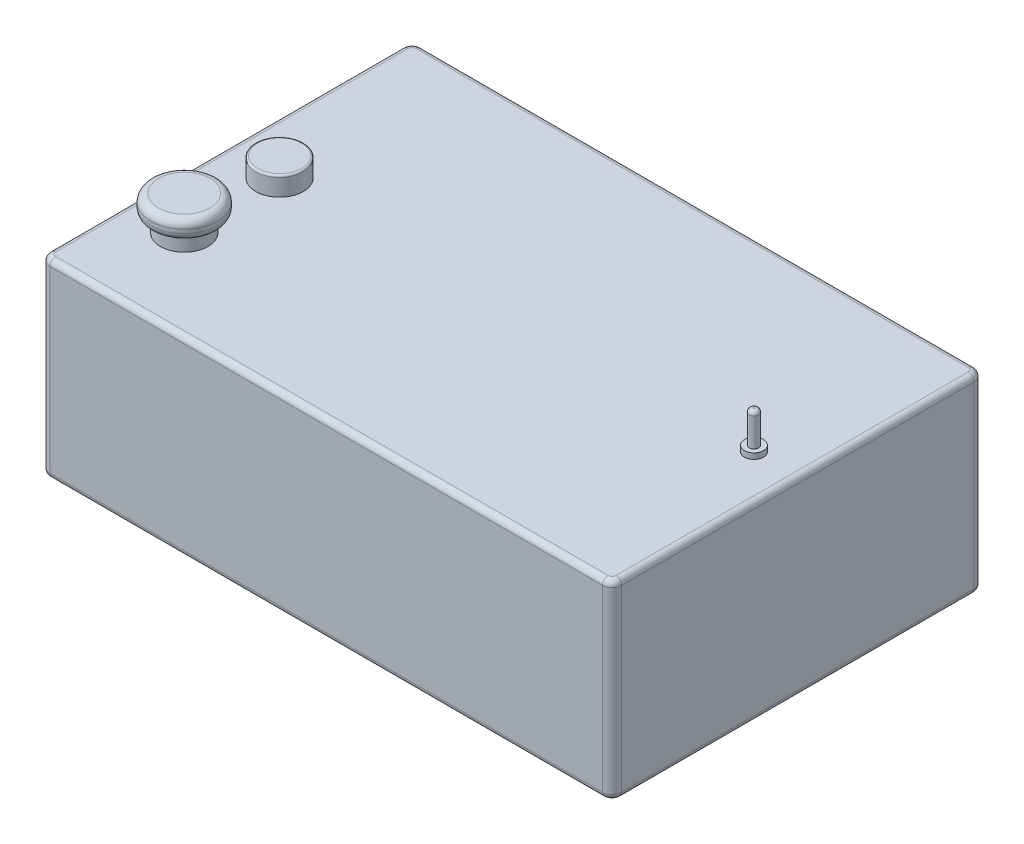
ISO-10303-21;
HEADER;
FILE_DESCRIPTION(('STEP AP214'),'2;1');
FILE_NAME('part.step','',(''),(''),'','','');
FILE_SCHEMA(('AUTOMOTIVE_DESIGN { 1 0 10303 214 1 1 1 1 }'));
ENDSEC;
DATA;
#1=APPLICATION_CONTEXT('core data for automotive mechanical design processes');
#2=APPLICATION_PROTOCOL_DEFINITION('international standard','automotive_design',2000,#1);
#3=PRODUCT_CONTEXT('',#1,'mechanical');
#4=PRODUCT('Part','Part','',(#3));
#5=PRODUCT_RELATED_PRODUCT_CATEGORY('part','',(#4));
#6=PRODUCT_DEFINITION_FORMATION('','',#4);
#7=PRODUCT_DEFINITION_CONTEXT('part definition',#1,'design');
#8=PRODUCT_DEFINITION('design','',#6,#7);
#9=PRODUCT_DEFINITION_SHAPE('','',#8);
#10=(LENGTH_UNIT() NAMED_UNIT(*) SI_UNIT(.MILLI.,.METRE.));
#11=(NAMED_UNIT(*) PLANE_ANGLE_UNIT() SI_UNIT($,.RADIAN.));
#12=(NAMED_UNIT(*) SI_UNIT($,.STERADIAN.) SOLID_ANGLE_UNIT());
#13=UNCERTAINTY_MEASURE_WITH_UNIT(LENGTH_MEASURE(1.E-05),#10,'distance_accuracy_value','');
#14=(GEOMETRIC_REPRESENTATION_CONTEXT(3) GLOBAL_UNCERTAINTY_ASSIGNED_CONTEXT((#13)) GLOBAL_UNIT_ASSIGNED_CONTEXT((#10,
#11,#12)) REPRESENTATION_CONTEXT('',''));
#15=CARTESIAN_POINT('',(0.,0.,0.));
#16=DIRECTION('',(0.,0.,1.));
#17=DIRECTION('',(1.,0.,0.));
#18=AXIS2_PLACEMENT_3D('',#15,#16,#17);
#19=CARTESIAN_POINT('',(-145.,100.,92.5));
#20=DIRECTION('',(0.,-1.,0.));
#21=DIRECTION('',(0.,0.,-1.));
#22=AXIS2_PLACEMENT_3D('',#19,#20,#21);
#23=CYLINDRICAL_SURFACE('',#22,5.00000000000002);
#24=DIRECTION('',(0.,-1.,0.));
#25=VECTOR('',#24,1.);
#26=CARTESIAN_POINT('',(-150.,100.,92.5));
#27=LINE('',#26,#25);
#28=CARTESIAN_POINT('',(-150.,97.,92.5));
#29=VERTEX_POINT('',#28);
#30=CARTESIAN_POINT('',(-150.,3.,92.5));
#31=VERTEX_POINT('',#30);
#32=EDGE_CURVE('E266',#29,#31,#27,.T.);
#33=ORIENTED_EDGE('',*,*,#32,.T.);
#34=CARTESIAN_POINT('',(-145.,3.,92.5));
#35=DIRECTION('',(0.,1.,0.));
#36=DIRECTION('',(0.,0.,1.));
#37=AXIS2_PLACEMENT_3D('',#34,#35,#36);
#38=CIRCLE('',#37,5.00000000000002);
#39=CARTESIAN_POINT('',(-145.,3.,97.5));
#40=VERTEX_POINT('',#39);
#41=EDGE_CURVE('E353',#31,#40,#38,.T.);
#42=ORIENTED_EDGE('',*,*,#41,.T.);
#43=DIRECTION('',(0.,-1.,0.));
#44=VECTOR('',#43,1.);
#45=CARTESIAN_POINT('',(-145.,100.,97.5));
#46=LINE('',#45,#44);
#47=CARTESIAN_POINT('',(-145.,97.,97.5));
#48=VERTEX_POINT('',#47);
#49=EDGE_CURVE('E180',#48,#40,#46,.T.);
#50=ORIENTED_EDGE('',*,*,#49,.F.);
#51=CARTESIAN_POINT('',(-145.,97.,92.5));
#52=DIRECTION('',(0.,1.,0.));
#53=DIRECTION('',(0.,0.,1.));
#54=AXIS2_PLACEMENT_3D('',#51,#52,#53);
#55=CIRCLE('',#54,5.00000000000002);
#56=EDGE_CURVE('E350',#48,#29,#55,.F.);
#57=ORIENTED_EDGE('',*,*,#56,.T.);
#58=EDGE_LOOP('',(#33,#42,#50,#57));
#59=FACE_BOUND('',#58,.T.);
#60=ADVANCED_FACE('F39',(#59),#23,.T.);
#61=CARTESIAN_POINT('',(-145.,100.,97.5));
#62=DIRECTION('',(0.,0.,-1.));
#63=DIRECTION('',(-1.,0.,0.));
#64=AXIS2_PLACEMENT_3D('',#61,#62,#63);
#65=PLANE('',#64);
#66=ORIENTED_EDGE('',*,*,#49,.T.);
#67=DIRECTION('',(1.,0.,0.));
#68=VECTOR('',#67,1.);
#69=CARTESIAN_POINT('',(-145.,3.,97.5));
#70=LINE('',#69,#68);
#71=CARTESIAN_POINT('',(145.,3.,97.5));
#72=VERTEX_POINT('',#71);
#73=EDGE_CURVE('E178',#40,#72,#70,.T.);
#74=ORIENTED_EDGE('',*,*,#73,.T.);
#75=DIRECTION('',(0.,-1.,0.));
#76=VECTOR('',#75,1.);
#77=CARTESIAN_POINT('',(145.,100.,97.5));
#78=LINE('',#77,#76);
#79=CARTESIAN_POINT('',(145.,97.,97.5));
#80=VERTEX_POINT('',#79);
#81=EDGE_CURVE('E159',#80,#72,#78,.T.);
#82=ORIENTED_EDGE('',*,*,#81,.F.);
#83=DIRECTION('',(1.,0.,0.));
#84=VECTOR('',#83,1.);
#85=CARTESIAN_POINT('',(-145.,97.,97.5));
#86=LINE('',#85,#84);
#87=EDGE_CURVE('E175',#80,#48,#86,.F.);
#88=ORIENTED_EDGE('',*,*,#87,.T.);
#89=EDGE_LOOP('',(#66,#74,#82,#88));
#90=FACE_BOUND('',#89,.T.);
#91=ADVANCED_FACE('F174',(#90),#65,.F.);
#92=CARTESIAN_POINT('',(145.,100.,92.5));
#93=DIRECTION('',(0.,-1.,0.));
#94=DIRECTION('',(0.,0.,-1.));
#95=AXIS2_PLACEMENT_3D('',#92,#93,#94);
#96=CYLINDRICAL_SURFACE('',#95,5.00000000000003);
#97=ORIENTED_EDGE('',*,*,#81,.T.);
#98=CARTESIAN_POINT('',(145.,3.,92.5));
#99=DIRECTION('',(0.,1.,0.));
#100=DIRECTION('',(0.,0.,1.));
#101=AXIS2_PLACEMENT_3D('',#98,#99,#100);
#102=CIRCLE('',#101,5.00000000000003);
#103=CARTESIAN_POINT('',(150.,3.,92.5));
#104=VERTEX_POINT('',#103);
#105=EDGE_CURVE('E167',#72,#104,#102,.T.);
#106=ORIENTED_EDGE('',*,*,#105,.T.);
#107=DIRECTION('',(0.,-1.,0.));
#108=VECTOR('',#107,1.);
#109=CARTESIAN_POINT('',(150.,100.,92.5));
#110=LINE('',#109,#108);
#111=CARTESIAN_POINT('',(150.,97.,92.5));
#112=VERTEX_POINT('',#111);
#113=EDGE_CURVE('E161',#112,#104,#110,.T.);
#114=ORIENTED_EDGE('',*,*,#113,.F.);
#115=CARTESIAN_POINT('',(145.,97.,92.5));
#116=DIRECTION('',(0.,1.,0.));
#117=DIRECTION('',(0.,0.,1.));
#118=AXIS2_PLACEMENT_3D('',#115,#116,#117);
#119=CIRCLE('',#118,5.00000000000003);
#120=EDGE_CURVE('E156',#112,#80,#119,.F.);
#121=ORIENTED_EDGE('',*,*,#120,.T.);
#122=EDGE_LOOP('',(#97,#106,#114,#121));
#123=FACE_BOUND('',#122,.T.);
#124=ADVANCED_FACE('F158',(#123),#96,.T.);
#125=CARTESIAN_POINT('',(150.,100.,-92.5));
#126=DIRECTION('',(-1.,0.,0.));
#127=DIRECTION('',(0.,0.,1.));
#128=AXIS2_PLACEMENT_3D('',#125,#126,#127);
#129=PLANE('',#128);
#130=ORIENTED_EDGE('',*,*,#113,.T.);
#131=DIRECTION('',(0.,0.,-1.));
#132=VECTOR('',#131,1.);
#133=CARTESIAN_POINT('',(150.,3.,-92.5));
#134=LINE('',#133,#132);
#135=CARTESIAN_POINT('',(150.,3.,-92.5));
#136=VERTEX_POINT('',#135);
#137=EDGE_CURVE('E322',#104,#136,#134,.T.);
#138=ORIENTED_EDGE('',*,*,#137,.T.);
#139=DIRECTION('',(0.,-1.,0.));
#140=VECTOR('',#139,1.);
#141=CARTESIAN_POINT('',(150.,100.,-92.5));
#142=LINE('',#141,#140);
#143=CARTESIAN_POINT('',(150.,97.,-92.5));
#144=VERTEX_POINT('',#143);
#145=EDGE_CURVE('E283',#144,#136,#142,.T.);
#146=ORIENTED_EDGE('',*,*,#145,.F.);
#147=DIRECTION('',(0.,0.,-1.));
#148=VECTOR('',#147,1.);
#149=CARTESIAN_POINT('',(150.,97.,92.5));
#150=LINE('',#149,#148);
#151=EDGE_CURVE('E319',#144,#112,#150,.F.);
#152=ORIENTED_EDGE('',*,*,#151,.T.);
#153=EDGE_LOOP('',(#130,#138,#146,#152));
#154=FACE_BOUND('',#153,.T.);
#155=ADVANCED_FACE('F454',(#154),#129,.F.);
#156=CARTESIAN_POINT('',(145.,100.,-92.5));
#157=DIRECTION('',(0.,-1.,0.));
#158=DIRECTION('',(0.,0.,-1.));
#159=AXIS2_PLACEMENT_3D('',#156,#157,#158);
#160=CYLINDRICAL_SURFACE('',#159,5.);
#161=ORIENTED_EDGE('',*,*,#145,.T.);
#162=CARTESIAN_POINT('',(145.,3.,-92.5));
#163=DIRECTION('',(0.,1.,0.));
#164=DIRECTION('',(0.,0.,1.));
#165=AXIS2_PLACEMENT_3D('',#162,#163,#164);
#166=CIRCLE('',#165,5.);
#167=CARTESIAN_POINT('',(145.,3.,-97.5));
#168=VERTEX_POINT('',#167);
#169=EDGE_CURVE('E329',#136,#168,#166,.T.);
#170=ORIENTED_EDGE('',*,*,#169,.T.);
#171=DIRECTION('',(0.,-1.,0.));
#172=VECTOR('',#171,1.);
#173=CARTESIAN_POINT('',(145.,100.,-97.5));
#174=LINE('',#173,#172);
#175=CARTESIAN_POINT('',(145.,97.,-97.5));
#176=VERTEX_POINT('',#175);
#177=EDGE_CURVE('E279',#176,#168,#174,.T.);
#178=ORIENTED_EDGE('',*,*,#177,.F.);
#179=CARTESIAN_POINT('',(145.,97.,-92.5));
#180=DIRECTION('',(0.,1.,0.));
#181=DIRECTION('',(0.,0.,1.));
#182=AXIS2_PLACEMENT_3D('',#179,#180,#181);
#183=CIRCLE('',#182,5.);
#184=EDGE_CURVE('E325',#176,#144,#183,.F.);
#185=ORIENTED_EDGE('',*,*,#184,.T.);
#186=EDGE_LOOP('',(#161,#170,#178,#185));
#187=FACE_BOUND('',#186,.T.);
#188=ADVANCED_FACE('F467',(#187),#160,.T.);
#189=CARTESIAN_POINT('',(-145.,100.,-97.5));
#190=DIRECTION('',(0.,0.,1.));
#191=DIRECTION('',(1.,0.,0.));
#192=AXIS2_PLACEMENT_3D('',#189,#190,#191);
#193=PLANE('',#192);
#194=ORIENTED_EDGE('',*,*,#177,.T.);
#195=DIRECTION('',(-1.,0.,0.));
#196=VECTOR('',#195,1.);
#197=CARTESIAN_POINT('',(-145.,3.,-97.5));
#198=LINE('',#197,#196);
#199=CARTESIAN_POINT('',(-145.,3.,-97.5));
#200=VERTEX_POINT('',#199);
#201=EDGE_CURVE('E335',#168,#200,#198,.T.);
#202=ORIENTED_EDGE('',*,*,#201,.T.);
#203=DIRECTION('',(0.,-1.,0.));
#204=VECTOR('',#203,1.);
#205=CARTESIAN_POINT('',(-145.,100.,-97.5));
#206=LINE('',#205,#204);
#207=CARTESIAN_POINT('',(-145.,97.,-97.5));
#208=VERTEX_POINT('',#207);
#209=EDGE_CURVE('E275',#208,#200,#206,.T.);
#210=ORIENTED_EDGE('',*,*,#209,.F.);
#211=DIRECTION('',(-1.,0.,0.));
#212=VECTOR('',#211,1.);
#213=CARTESIAN_POINT('',(145.,97.,-97.5));
#214=LINE('',#213,#212);
#215=EDGE_CURVE('E332',#208,#176,#214,.F.);
#216=ORIENTED_EDGE('',*,*,#215,.T.);
#217=EDGE_LOOP('',(#194,#202,#210,#216));
#218=FACE_BOUND('',#217,.T.);
#219=ADVANCED_FACE('F470',(#218),#193,.F.);
#220=CARTESIAN_POINT('',(-145.,100.,-92.5));
#221=DIRECTION('',(0.,-1.,0.));
#222=DIRECTION('',(0.,0.,-1.));
#223=AXIS2_PLACEMENT_3D('',#220,#221,#222);
#224=CYLINDRICAL_SURFACE('',#223,5.00000000000002);
#225=ORIENTED_EDGE('',*,*,#209,.T.);
#226=CARTESIAN_POINT('',(-145.,3.,-92.5));
#227=DIRECTION('',(0.,1.,0.));
#228=DIRECTION('',(0.,0.,1.));
#229=AXIS2_PLACEMENT_3D('',#226,#227,#228);
#230=CIRCLE('',#229,5.00000000000002);
#231=CARTESIAN_POINT('',(-150.,3.,-92.5));
#232=VERTEX_POINT('',#231);
#233=EDGE_CURVE('E341',#200,#232,#230,.T.);
#234=ORIENTED_EDGE('',*,*,#233,.T.);
#235=DIRECTION('',(0.,-1.,0.));
#236=VECTOR('',#235,1.);
#237=CARTESIAN_POINT('',(-150.,100.,-92.5));
#238=LINE('',#237,#236);
#239=CARTESIAN_POINT('',(-150.,97.,-92.5));
#240=VERTEX_POINT('',#239);
#241=EDGE_CURVE('E270',#240,#232,#238,.T.);
#242=ORIENTED_EDGE('',*,*,#241,.F.);
#243=CARTESIAN_POINT('',(-145.,97.,-92.5));
#244=DIRECTION('',(0.,1.,0.));
#245=DIRECTION('',(0.,0.,1.));
#246=AXIS2_PLACEMENT_3D('',#243,#244,#245);
#247=CIRCLE('',#246,5.00000000000002);
#248=EDGE_CURVE('E338',#240,#208,#247,.F.);
#249=ORIENTED_EDGE('',*,*,#248,.T.);
#250=EDGE_LOOP('',(#225,#234,#242,#249));
#251=FACE_BOUND('',#250,.T.);
#252=ADVANCED_FACE('F482',(#251),#224,.T.);
#253=CARTESIAN_POINT('',(-150.,100.,-92.5));
#254=DIRECTION('',(1.,0.,0.));
#255=DIRECTION('',(0.,0.,-1.));
#256=AXIS2_PLACEMENT_3D('',#253,#254,#255);
#257=PLANE('',#256);
#258=ORIENTED_EDGE('',*,*,#241,.T.);
#259=DIRECTION('',(0.,0.,1.));
#260=VECTOR('',#259,1.);
#261=CARTESIAN_POINT('',(-150.,3.,-92.5));
#262=LINE('',#261,#260);
#263=EDGE_CURVE('E347',#232,#31,#262,.T.);
#264=ORIENTED_EDGE('',*,*,#263,.T.);
#265=ORIENTED_EDGE('',*,*,#32,.F.);
#266=DIRECTION('',(0.,0.,1.));
#267=VECTOR('',#266,1.);
#268=CARTESIAN_POINT('',(-150.,97.,-92.5));
#269=LINE('',#268,#267);
#270=EDGE_CURVE('E344',#29,#240,#269,.F.);
#271=ORIENTED_EDGE('',*,*,#270,.T.);
#272=EDGE_LOOP('',(#258,#264,#265,#271));
#273=FACE_BOUND('',#272,.T.);
#274=ADVANCED_FACE('F431',(#273),#257,.F.);
#275=CARTESIAN_POINT('',(-145.,100.,92.5));
#276=DIRECTION('',(0.,1.,0.));
#277=DIRECTION('',(0.,0.,1.));
#278=AXIS2_PLACEMENT_3D('',#275,#276,#277);
#279=PLANE('',#278);
#280=CARTESIAN_POINT('',(127.,100.,0.));
#281=DIRECTION('',(0.,1.,0.));
#282=DIRECTION('',(0.,0.,1.));
#283=AXIS2_PLACEMENT_3D('',#280,#281,#282);
#284=CIRCLE('',#283,4.99999999999999);
#285=CARTESIAN_POINT('',(127.,100.,4.99999999999999));
#286=VERTEX_POINT('',#285);
#287=EDGE_CURVE('E251',#286,#286,#284,.T.);
#288=ORIENTED_EDGE('',*,*,#287,.F.);
#289=EDGE_LOOP('',(#288));
#290=FACE_BOUND('',#289,.T.);
#291=CARTESIAN_POINT('',(-122.,100.,50.));
#292=DIRECTION('',(0.,1.,0.));
#293=DIRECTION('',(0.,0.,1.));
#294=AXIS2_PLACEMENT_3D('',#291,#292,#293);
#295=CIRCLE('',#294,12.5);
#296=CARTESIAN_POINT('',(-122.,100.,62.5));
#297=VERTEX_POINT('',#296);
#298=EDGE_CURVE('E250',#297,#297,#295,.T.);
#299=ORIENTED_EDGE('',*,*,#298,.F.);
#300=EDGE_LOOP('',(#299));
#301=FACE_BOUND('',#300,.T.);
#302=CARTESIAN_POINT('',(-122.,100.,0.));
#303=DIRECTION('',(0.,1.,0.));
#304=DIRECTION('',(0.,0.,1.));
#305=AXIS2_PLACEMENT_3D('',#302,#303,#304);
#306=CIRCLE('',#305,12.5);
#307=CARTESIAN_POINT('',(-122.,100.,12.5));
#308=VERTEX_POINT('',#307);
#309=EDGE_CURVE('E259',#308,#308,#306,.T.);
#310=ORIENTED_EDGE('',*,*,#309,.F.);
#311=EDGE_LOOP('',(#310));
#312=FACE_BOUND('',#311,.T.);
#313=DIRECTION('',(0.,0.,-1.));
#314=VECTOR('',#313,1.);
#315=CARTESIAN_POINT('',(147.,100.,-92.5));
#316=LINE('',#315,#314);
#317=CARTESIAN_POINT('',(147.,100.,92.5));
#318=VERTEX_POINT('',#317);
#319=CARTESIAN_POINT('',(147.,100.,-92.5));
#320=VERTEX_POINT('',#319);
#321=EDGE_CURVE('E356',#318,#320,#316,.T.);
#322=ORIENTED_EDGE('',*,*,#321,.T.);
#323=CARTESIAN_POINT('',(145.,100.,-92.5));
#324=DIRECTION('',(0.,1.,0.));
#325=DIRECTION('',(0.,0.,1.));
#326=AXIS2_PLACEMENT_3D('',#323,#324,#325);
#327=CIRCLE('',#326,2.);
#328=CARTESIAN_POINT('',(145.,100.,-94.5));
#329=VERTEX_POINT('',#328);
#330=EDGE_CURVE('E216',#320,#329,#327,.T.);
#331=ORIENTED_EDGE('',*,*,#330,.T.);
#332=DIRECTION('',(-1.,0.,0.));
#333=VECTOR('',#332,1.);
#334=CARTESIAN_POINT('',(-145.,100.,-94.5));
#335=LINE('',#334,#333);
#336=CARTESIAN_POINT('',(-145.,100.,-94.5));
#337=VERTEX_POINT('',#336);
#338=EDGE_CURVE('E62',#329,#337,#335,.T.);
#339=ORIENTED_EDGE('',*,*,#338,.T.);
#340=CARTESIAN_POINT('',(-145.,100.,-92.5));
#341=DIRECTION('',(0.,1.,0.));
#342=DIRECTION('',(0.,0.,1.));
#343=AXIS2_PLACEMENT_3D('',#340,#341,#342);
#344=CIRCLE('',#343,2.00000000000002);
#345=CARTESIAN_POINT('',(-147.,100.,-92.5));
#346=VERTEX_POINT('',#345);
#347=EDGE_CURVE('E370',#337,#346,#344,.T.);
#348=ORIENTED_EDGE('',*,*,#347,.T.);
#349=DIRECTION('',(0.,0.,1.));
#350=VECTOR('',#349,1.);
#351=CARTESIAN_POINT('',(-147.,100.,92.5));
#352=LINE('',#351,#350);
#353=CARTESIAN_POINT('',(-147.,100.,92.5));
#354=VERTEX_POINT('',#353);
#355=EDGE_CURVE('E367',#346,#354,#352,.T.);
#356=ORIENTED_EDGE('',*,*,#355,.T.);
#357=CARTESIAN_POINT('',(-145.,100.,92.5));
#358=DIRECTION('',(0.,1.,0.));
#359=DIRECTION('',(0.,0.,1.));
#360=AXIS2_PLACEMENT_3D('',#357,#358,#359);
#361=CIRCLE('',#360,2.00000000000002);
#362=CARTESIAN_POINT('',(-145.,100.,94.5));
#363=VERTEX_POINT('',#362);
#364=EDGE_CURVE('E364',#354,#363,#361,.T.);
#365=ORIENTED_EDGE('',*,*,#364,.T.);
#366=DIRECTION('',(1.,0.,0.));
#367=VECTOR('',#366,1.);
#368=CARTESIAN_POINT('',(145.,100.,94.5));
#369=LINE('',#368,#367);
#370=CARTESIAN_POINT('',(145.,100.,94.5));
#371=VERTEX_POINT('',#370);
#372=EDGE_CURVE('E361',#363,#371,#369,.T.);
#373=ORIENTED_EDGE('',*,*,#372,.T.);
#374=CARTESIAN_POINT('',(145.,100.,92.5));
#375=DIRECTION('',(0.,1.,0.));
#376=DIRECTION('',(0.,0.,1.));
#377=AXIS2_PLACEMENT_3D('',#374,#375,#376);
#378=CIRCLE('',#377,2.00000000000003);
#379=EDGE_CURVE('E194',#371,#318,#378,.T.);
#380=ORIENTED_EDGE('',*,*,#379,.T.);
#381=EDGE_LOOP('',(#322,#331,#339,#348,#356,#365,#373,#380));
#382=FACE_BOUND('',#381,.T.);
#383=ADVANCED_FACE('F419',(#290,#301,#312,#382),#279,.T.);
#384=CARTESIAN_POINT('',(-145.,0.,92.5));
#385=DIRECTION('',(0.,1.,0.));
#386=DIRECTION('',(0.,0.,1.));
#387=AXIS2_PLACEMENT_3D('',#384,#385,#386);
#388=PLANE('',#387);
#389=CARTESIAN_POINT('',(145.,0.,92.5));
#390=DIRECTION('',(0.,1.,0.));
#391=DIRECTION('',(0.,0.,1.));
#392=AXIS2_PLACEMENT_3D('',#389,#390,#391);
#393=CIRCLE('',#392,2.00000000000003);
#394=CARTESIAN_POINT('',(147.,0.,92.5));
#395=VERTEX_POINT('',#394);
#396=CARTESIAN_POINT('',(145.,0.,94.5));
#397=VERTEX_POINT('',#396);
#398=EDGE_CURVE('E311',#395,#397,#393,.F.);
#399=ORIENTED_EDGE('',*,*,#398,.T.);
#400=DIRECTION('',(1.,0.,0.));
#401=VECTOR('',#400,1.);
#402=CARTESIAN_POINT('',(-145.,0.,94.5));
#403=LINE('',#402,#401);
#404=CARTESIAN_POINT('',(-145.,0.,94.5));
#405=VERTEX_POINT('',#404);
#406=EDGE_CURVE('E168',#397,#405,#403,.F.);
#407=ORIENTED_EDGE('',*,*,#406,.T.);
#408=CARTESIAN_POINT('',(-145.,0.,92.5));
#409=DIRECTION('',(0.,1.,0.));
#410=DIRECTION('',(0.,0.,1.));
#411=AXIS2_PLACEMENT_3D('',#408,#409,#410);
#412=CIRCLE('',#411,2.00000000000002);
#413=CARTESIAN_POINT('',(-147.,0.,92.5));
#414=VERTEX_POINT('',#413);
#415=EDGE_CURVE('E293',#405,#414,#412,.F.);
#416=ORIENTED_EDGE('',*,*,#415,.T.);
#417=DIRECTION('',(0.,0.,1.));
#418=VECTOR('',#417,1.);
#419=CARTESIAN_POINT('',(-147.,0.,92.5));
#420=LINE('',#419,#418);
#421=CARTESIAN_POINT('',(-147.,0.,-92.5));
#422=VERTEX_POINT('',#421);
#423=EDGE_CURVE('E296',#414,#422,#420,.F.);
#424=ORIENTED_EDGE('',*,*,#423,.T.);
#425=CARTESIAN_POINT('',(-145.,0.,-92.5));
#426=DIRECTION('',(0.,1.,0.));
#427=DIRECTION('',(0.,0.,1.));
#428=AXIS2_PLACEMENT_3D('',#425,#426,#427);
#429=CIRCLE('',#428,2.00000000000002);
#430=CARTESIAN_POINT('',(-145.,0.,-94.5));
#431=VERTEX_POINT('',#430);
#432=EDGE_CURVE('E299',#422,#431,#429,.F.);
#433=ORIENTED_EDGE('',*,*,#432,.T.);
#434=DIRECTION('',(-1.,0.,0.));
#435=VECTOR('',#434,1.);
#436=CARTESIAN_POINT('',(-145.,0.,-94.5));
#437=LINE('',#436,#435);
#438=CARTESIAN_POINT('',(145.,0.,-94.5));
#439=VERTEX_POINT('',#438);
#440=EDGE_CURVE('E302',#431,#439,#437,.F.);
#441=ORIENTED_EDGE('',*,*,#440,.T.);
#442=CARTESIAN_POINT('',(145.,0.,-92.5));
#443=DIRECTION('',(0.,1.,0.));
#444=DIRECTION('',(0.,0.,1.));
#445=AXIS2_PLACEMENT_3D('',#442,#443,#444);
#446=CIRCLE('',#445,2.);
#447=CARTESIAN_POINT('',(147.,0.,-92.5));
#448=VERTEX_POINT('',#447);
#449=EDGE_CURVE('E305',#439,#448,#446,.F.);
#450=ORIENTED_EDGE('',*,*,#449,.T.);
#451=DIRECTION('',(0.,0.,-1.));
#452=VECTOR('',#451,1.);
#453=CARTESIAN_POINT('',(147.,0.,92.5));
#454=LINE('',#453,#452);
#455=EDGE_CURVE('E308',#448,#395,#454,.F.);
#456=ORIENTED_EDGE('',*,*,#455,.T.);
#457=EDGE_LOOP('',(#399,#407,#416,#424,#433,#441,#450,#456));
#458=FACE_BOUND('',#457,.T.);
#459=ADVANCED_FACE('F523',(#458),#388,.F.);
#460=CARTESIAN_POINT('',(-145.,3.,-94.5));
#461=DIRECTION('',(-1.,0.,0.));
#462=DIRECTION('',(0.,0.,1.));
#463=AXIS2_PLACEMENT_3D('',#460,#461,#462);
#464=CYLINDRICAL_SURFACE('',#463,3.);
#465=CARTESIAN_POINT('',(145.,3.,-94.5));
#466=DIRECTION('',(1.,0.,0.));
#467=DIRECTION('',(0.,0.,-1.));
#468=AXIS2_PLACEMENT_3D('',#465,#466,#467);
#469=CIRCLE('',#468,3.);
#470=EDGE_CURVE('E398',#439,#168,#469,.T.);
#471=ORIENTED_EDGE('',*,*,#470,.F.);
#472=ORIENTED_EDGE('',*,*,#440,.F.);
#473=CARTESIAN_POINT('',(-145.,3.,-94.5));
#474=DIRECTION('',(-1.,0.,0.));
#475=DIRECTION('',(0.,0.,1.));
#476=AXIS2_PLACEMENT_3D('',#473,#474,#475);
#477=CIRCLE('',#476,3.);
#478=EDGE_CURVE('E271',#200,#431,#477,.T.);
#479=ORIENTED_EDGE('',*,*,#478,.F.);
#480=ORIENTED_EDGE('',*,*,#201,.F.);
#481=EDGE_LOOP('',(#471,#472,#479,#480));
#482=FACE_BOUND('',#481,.T.);
#483=ADVANCED_FACE('F475',(#482),#464,.T.);
#484=CARTESIAN_POINT('',(-145.,3.,-92.5));
#485=DIRECTION('',(0.,1.,0.));
#486=DIRECTION('',(0.,0.,1.));
#487=AXIS2_PLACEMENT_3D('',#484,#485,#486);
#488=DEGENERATE_TOROIDAL_SURFACE('',#487,2.00000000000002,3.,.T.);
#489=ORIENTED_EDGE('',*,*,#478,.T.);
#490=ORIENTED_EDGE('',*,*,#432,.F.);
#491=CARTESIAN_POINT('',(-147.,3.,-92.5));
#492=DIRECTION('',(0.,0.,1.));
#493=DIRECTION('',(1.,0.,0.));
#494=AXIS2_PLACEMENT_3D('',#491,#492,#493);
#495=CIRCLE('',#494,3.);
#496=EDGE_CURVE('E394',#232,#422,#495,.T.);
#497=ORIENTED_EDGE('',*,*,#496,.F.);
#498=ORIENTED_EDGE('',*,*,#233,.F.);
#499=EDGE_LOOP('',(#489,#490,#497,#498));
#500=FACE_BOUND('',#499,.T.);
#501=ADVANCED_FACE('F480',(#500),#488,.T.);
#502=CARTESIAN_POINT('',(145.,3.,-92.5));
#503=DIRECTION('',(0.,1.,0.));
#504=DIRECTION('',(0.,0.,1.));
#505=AXIS2_PLACEMENT_3D('',#502,#503,#504);
#506=DEGENERATE_TOROIDAL_SURFACE('',#505,2.,3.,.T.);
#507=ORIENTED_EDGE('',*,*,#470,.T.);
#508=ORIENTED_EDGE('',*,*,#169,.F.);
#509=CARTESIAN_POINT('',(147.,3.,-92.5));
#510=DIRECTION('',(0.,0.,1.));
#511=DIRECTION('',(1.,0.,0.));
#512=AXIS2_PLACEMENT_3D('',#509,#510,#511);
#513=CIRCLE('',#512,3.);
#514=EDGE_CURVE('E390',#448,#136,#513,.T.);
#515=ORIENTED_EDGE('',*,*,#514,.F.);
#516=ORIENTED_EDGE('',*,*,#449,.F.);
#517=EDGE_LOOP('',(#507,#508,#515,#516));
#518=FACE_BOUND('',#517,.T.);
#519=ADVANCED_FACE('F463',(#518),#506,.T.);
#520=CARTESIAN_POINT('',(-147.,3.,-92.5));
#521=DIRECTION('',(0.,0.,1.));
#522=DIRECTION('',(1.,0.,0.));
#523=AXIS2_PLACEMENT_3D('',#520,#521,#522);
#524=CYLINDRICAL_SURFACE('',#523,3.);
#525=ORIENTED_EDGE('',*,*,#496,.T.);
#526=ORIENTED_EDGE('',*,*,#423,.F.);
#527=CARTESIAN_POINT('',(-147.,3.,92.5));
#528=DIRECTION('',(0.,0.,1.));
#529=DIRECTION('',(1.,0.,0.));
#530=AXIS2_PLACEMENT_3D('',#527,#528,#529);
#531=CIRCLE('',#530,3.);
#532=EDGE_CURVE('E386',#31,#414,#531,.T.);
#533=ORIENTED_EDGE('',*,*,#532,.F.);
#534=ORIENTED_EDGE('',*,*,#263,.F.);
#535=EDGE_LOOP('',(#525,#526,#533,#534));
#536=FACE_BOUND('',#535,.T.);
#537=ADVANCED_FACE('F436',(#536),#524,.T.);
#538=CARTESIAN_POINT('',(147.,3.,-92.5));
#539=DIRECTION('',(0.,0.,-1.));
#540=DIRECTION('',(-1.,0.,0.));
#541=AXIS2_PLACEMENT_3D('',#538,#539,#540);
#542=CYLINDRICAL_SURFACE('',#541,3.);
#543=ORIENTED_EDGE('',*,*,#514,.T.);
#544=ORIENTED_EDGE('',*,*,#137,.F.);
#545=CARTESIAN_POINT('',(147.,3.,92.5));
#546=DIRECTION('',(0.,0.,1.));
#547=DIRECTION('',(1.,0.,0.));
#548=AXIS2_PLACEMENT_3D('',#545,#546,#547);
#549=CIRCLE('',#548,3.);
#550=EDGE_CURVE('E382',#395,#104,#549,.T.);
#551=ORIENTED_EDGE('',*,*,#550,.F.);
#552=ORIENTED_EDGE('',*,*,#455,.F.);
#553=EDGE_LOOP('',(#543,#544,#551,#552));
#554=FACE_BOUND('',#553,.T.);
#555=ADVANCED_FACE('F457',(#554),#542,.T.);
#556=CARTESIAN_POINT('',(-145.,3.,92.5));
#557=DIRECTION('',(0.,1.,0.));
#558=DIRECTION('',(0.,0.,1.));
#559=AXIS2_PLACEMENT_3D('',#556,#557,#558);
#560=DEGENERATE_TOROIDAL_SURFACE('',#559,2.00000000000002,3.,.T.);
#561=ORIENTED_EDGE('',*,*,#532,.T.);
#562=ORIENTED_EDGE('',*,*,#415,.F.);
#563=CARTESIAN_POINT('',(-145.,3.,94.5));
#564=DIRECTION('',(1.,0.,0.));
#565=DIRECTION('',(0.,0.,-1.));
#566=AXIS2_PLACEMENT_3D('',#563,#564,#565);
#567=CIRCLE('',#566,3.);
#568=EDGE_CURVE('E379',#40,#405,#567,.T.);
#569=ORIENTED_EDGE('',*,*,#568,.F.);
#570=ORIENTED_EDGE('',*,*,#41,.F.);
#571=EDGE_LOOP('',(#561,#562,#569,#570));
#572=FACE_BOUND('',#571,.T.);
#573=ADVANCED_FACE('F442',(#572),#560,.T.);
#574=CARTESIAN_POINT('',(145.,3.,92.5));
#575=DIRECTION('',(0.,1.,0.));
#576=DIRECTION('',(0.,0.,1.));
#577=AXIS2_PLACEMENT_3D('',#574,#575,#576);
#578=DEGENERATE_TOROIDAL_SURFACE('',#577,2.00000000000003,3.,.T.);
#579=ORIENTED_EDGE('',*,*,#550,.T.);
#580=ORIENTED_EDGE('',*,*,#105,.F.);
#581=CARTESIAN_POINT('',(145.,3.,94.5));
#582=DIRECTION('',(-1.,0.,0.));
#583=DIRECTION('',(0.,0.,1.));
#584=AXIS2_PLACEMENT_3D('',#581,#582,#583);
#585=CIRCLE('',#584,3.);
#586=EDGE_CURVE('E210',#397,#72,#585,.T.);
#587=ORIENTED_EDGE('',*,*,#586,.F.);
#588=ORIENTED_EDGE('',*,*,#398,.F.);
#589=EDGE_LOOP('',(#579,#580,#587,#588));
#590=FACE_BOUND('',#589,.T.);
#591=ADVANCED_FACE('F450',(#590),#578,.T.);
#592=CARTESIAN_POINT('',(-145.,3.,94.5));
#593=DIRECTION('',(1.,0.,0.));
#594=DIRECTION('',(0.,0.,-1.));
#595=AXIS2_PLACEMENT_3D('',#592,#593,#594);
#596=CYLINDRICAL_SURFACE('',#595,3.);
#597=ORIENTED_EDGE('',*,*,#568,.T.);
#598=ORIENTED_EDGE('',*,*,#406,.F.);
#599=ORIENTED_EDGE('',*,*,#586,.T.);
#600=ORIENTED_EDGE('',*,*,#73,.F.);
#601=EDGE_LOOP('',(#597,#598,#599,#600));
#602=FACE_BOUND('',#601,.T.);
#603=ADVANCED_FACE('F445',(#602),#596,.T.);
#604=CARTESIAN_POINT('',(-145.,97.,92.5));
#605=DIRECTION('',(0.,1.,0.));
#606=DIRECTION('',(0.,0.,1.));
#607=AXIS2_PLACEMENT_3D('',#604,#605,#606);
#608=DEGENERATE_TOROIDAL_SURFACE('',#607,2.00000000000002,3.,.T.);
#609=CARTESIAN_POINT('',(-147.,97.,92.5));
#610=DIRECTION('',(0.,0.,-1.));
#611=DIRECTION('',(-1.,0.,0.));
#612=AXIS2_PLACEMENT_3D('',#609,#610,#611);
#613=CIRCLE('',#612,3.);
#614=EDGE_CURVE('E196',#29,#354,#613,.T.);
#615=ORIENTED_EDGE('',*,*,#614,.F.);
#616=ORIENTED_EDGE('',*,*,#56,.F.);
#617=CARTESIAN_POINT('',(-145.,97.,94.5));
#618=DIRECTION('',(1.,0.,0.));
#619=DIRECTION('',(0.,0.,-1.));
#620=AXIS2_PLACEMENT_3D('',#617,#618,#619);
#621=CIRCLE('',#620,3.);
#622=EDGE_CURVE('E190',#363,#48,#621,.T.);
#623=ORIENTED_EDGE('',*,*,#622,.F.);
#624=ORIENTED_EDGE('',*,*,#364,.F.);
#625=EDGE_LOOP('',(#615,#616,#623,#624));
#626=FACE_BOUND('',#625,.T.);
#627=ADVANCED_FACE('F425',(#626),#608,.T.);
#628=CARTESIAN_POINT('',(-145.,97.,94.5));
#629=DIRECTION('',(-1.,0.,0.));
#630=DIRECTION('',(0.,0.,1.));
#631=AXIS2_PLACEMENT_3D('',#628,#629,#630);
#632=CYLINDRICAL_SURFACE('',#631,3.);
#633=ORIENTED_EDGE('',*,*,#622,.T.);
#634=ORIENTED_EDGE('',*,*,#87,.F.);
#635=CARTESIAN_POINT('',(145.,97.,94.5));
#636=DIRECTION('',(1.,0.,0.));
#637=DIRECTION('',(0.,0.,-1.));
#638=AXIS2_PLACEMENT_3D('',#635,#636,#637);
#639=CIRCLE('',#638,3.);
#640=EDGE_CURVE('E187',#371,#80,#639,.T.);
#641=ORIENTED_EDGE('',*,*,#640,.F.);
#642=ORIENTED_EDGE('',*,*,#372,.F.);
#643=EDGE_LOOP('',(#633,#634,#641,#642));
#644=FACE_BOUND('',#643,.T.);
#645=ADVANCED_FACE('F185',(#644),#632,.T.);
#646=CARTESIAN_POINT('',(-147.,97.,92.5));
#647=DIRECTION('',(0.,0.,-1.));
#648=DIRECTION('',(-1.,0.,0.));
#649=AXIS2_PLACEMENT_3D('',#646,#647,#648);
#650=CYLINDRICAL_SURFACE('',#649,3.);
#651=ORIENTED_EDGE('',*,*,#614,.T.);
#652=ORIENTED_EDGE('',*,*,#355,.F.);
#653=CARTESIAN_POINT('',(-147.,97.,-92.5));
#654=DIRECTION('',(0.,0.,-1.));
#655=DIRECTION('',(-1.,0.,0.));
#656=AXIS2_PLACEMENT_3D('',#653,#654,#655);
#657=CIRCLE('',#656,3.);
#658=EDGE_CURVE('E197',#240,#346,#657,.T.);
#659=ORIENTED_EDGE('',*,*,#658,.F.);
#660=ORIENTED_EDGE('',*,*,#270,.F.);
#661=EDGE_LOOP('',(#651,#652,#659,#660));
#662=FACE_BOUND('',#661,.T.);
#663=ADVANCED_FACE('F679',(#662),#650,.T.);
#664=CARTESIAN_POINT('',(145.,97.,92.5));
#665=DIRECTION('',(0.,1.,0.));
#666=DIRECTION('',(0.,0.,1.));
#667=AXIS2_PLACEMENT_3D('',#664,#665,#666);
#668=DEGENERATE_TOROIDAL_SURFACE('',#667,2.00000000000003,3.,.T.);
#669=ORIENTED_EDGE('',*,*,#640,.T.);
#670=ORIENTED_EDGE('',*,*,#120,.F.);
#671=CARTESIAN_POINT('',(147.,97.,92.5));
#672=DIRECTION('',(0.,0.,-1.));
#673=DIRECTION('',(-1.,0.,0.));
#674=AXIS2_PLACEMENT_3D('',#671,#672,#673);
#675=CIRCLE('',#674,3.);
#676=EDGE_CURVE('E204',#318,#112,#675,.T.);
#677=ORIENTED_EDGE('',*,*,#676,.F.);
#678=ORIENTED_EDGE('',*,*,#379,.F.);
#679=EDGE_LOOP('',(#669,#670,#677,#678));
#680=FACE_BOUND('',#679,.T.);
#681=ADVANCED_FACE('F193',(#680),#668,.T.);
#682=CARTESIAN_POINT('',(-145.,97.,-92.5));
#683=DIRECTION('',(0.,1.,0.));
#684=DIRECTION('',(0.,0.,1.));
#685=AXIS2_PLACEMENT_3D('',#682,#683,#684);
#686=DEGENERATE_TOROIDAL_SURFACE('',#685,2.00000000000002,3.,.T.);
#687=ORIENTED_EDGE('',*,*,#658,.T.);
#688=ORIENTED_EDGE('',*,*,#347,.F.);
#689=CARTESIAN_POINT('',(-145.,97.,-94.5));
#690=DIRECTION('',(1.,0.,0.));
#691=DIRECTION('',(0.,0.,-1.));
#692=AXIS2_PLACEMENT_3D('',#689,#690,#691);
#693=CIRCLE('',#692,3.);
#694=EDGE_CURVE('E410',#208,#337,#693,.T.);
#695=ORIENTED_EDGE('',*,*,#694,.F.);
#696=ORIENTED_EDGE('',*,*,#248,.F.);
#697=EDGE_LOOP('',(#687,#688,#695,#696));
#698=FACE_BOUND('',#697,.T.);
#699=ADVANCED_FACE('F487',(#698),#686,.T.);
#700=CARTESIAN_POINT('',(147.,97.,92.5));
#701=DIRECTION('',(0.,0.,1.));
#702=DIRECTION('',(1.,0.,0.));
#703=AXIS2_PLACEMENT_3D('',#700,#701,#702);
#704=CYLINDRICAL_SURFACE('',#703,3.);
#705=ORIENTED_EDGE('',*,*,#676,.T.);
#706=ORIENTED_EDGE('',*,*,#151,.F.);
#707=CARTESIAN_POINT('',(147.,97.,-92.5));
#708=DIRECTION('',(0.,0.,-1.));
#709=DIRECTION('',(-1.,0.,0.));
#710=AXIS2_PLACEMENT_3D('',#707,#708,#709);
#711=CIRCLE('',#710,3.);
#712=EDGE_CURVE('E407',#320,#144,#711,.T.);
#713=ORIENTED_EDGE('',*,*,#712,.F.);
#714=ORIENTED_EDGE('',*,*,#321,.F.);
#715=EDGE_LOOP('',(#705,#706,#713,#714));
#716=FACE_BOUND('',#715,.T.);
#717=ADVANCED_FACE('F417',(#716),#704,.T.);
#718=CARTESIAN_POINT('',(-145.,97.,-94.5));
#719=DIRECTION('',(1.,0.,0.));
#720=DIRECTION('',(0.,0.,-1.));
#721=AXIS2_PLACEMENT_3D('',#718,#719,#720);
#722=CYLINDRICAL_SURFACE('',#721,3.);
#723=ORIENTED_EDGE('',*,*,#694,.T.);
#724=ORIENTED_EDGE('',*,*,#338,.F.);
#725=CARTESIAN_POINT('',(145.,97.,-94.5));
#726=DIRECTION('',(1.,0.,0.));
#727=DIRECTION('',(0.,0.,-1.));
#728=AXIS2_PLACEMENT_3D('',#725,#726,#727);
#729=CIRCLE('',#728,3.);
#730=EDGE_CURVE('E55',#176,#329,#729,.T.);
#731=ORIENTED_EDGE('',*,*,#730,.F.);
#732=ORIENTED_EDGE('',*,*,#215,.F.);
#733=EDGE_LOOP('',(#723,#724,#731,#732));
#734=FACE_BOUND('',#733,.T.);
#735=ADVANCED_FACE('F489',(#734),#722,.T.);
#736=CARTESIAN_POINT('',(145.,97.,-92.5));
#737=DIRECTION('',(0.,1.,0.));
#738=DIRECTION('',(0.,0.,1.));
#739=AXIS2_PLACEMENT_3D('',#736,#737,#738);
#740=DEGENERATE_TOROIDAL_SURFACE('',#739,2.,3.,.T.);
#741=ORIENTED_EDGE('',*,*,#712,.T.);
#742=ORIENTED_EDGE('',*,*,#184,.F.);
#743=ORIENTED_EDGE('',*,*,#730,.T.);
#744=ORIENTED_EDGE('',*,*,#330,.F.);
#745=EDGE_LOOP('',(#741,#742,#743,#744));
#746=FACE_BOUND('',#745,.T.);
#747=ADVANCED_FACE('F491',(#746),#740,.T.);
#748=CARTESIAN_POINT('',(-122.,110.,0.));
#749=DIRECTION('',(0.,-1.,0.));
#750=DIRECTION('',(0.,0.,-1.));
#751=AXIS2_PLACEMENT_3D('',#748,#749,#750);
#752=CYLINDRICAL_SURFACE('',#751,12.5);
#753=CARTESIAN_POINT('',(-122.,109.,0.));
#754=DIRECTION('',(0.,1.,0.));
#755=DIRECTION('',(0.,0.,1.));
#756=AXIS2_PLACEMENT_3D('',#753,#754,#755);
#757=CIRCLE('',#756,12.5);
#758=CARTESIAN_POINT('',(-122.,109.,12.5));
#759=VERTEX_POINT('',#758);
#760=EDGE_CURVE('E232',#759,#759,#757,.F.);
#761=ORIENTED_EDGE('',*,*,#760,.T.);
#762=EDGE_LOOP('',(#761));
#763=FACE_BOUND('',#762,.T.);
#764=ORIENTED_EDGE('',*,*,#309,.T.);
#765=EDGE_LOOP('',(#764));
#766=FACE_BOUND('',#765,.T.);
#767=ADVANCED_FACE('F497',(#763,#766),#752,.T.);
#768=CARTESIAN_POINT('',(-122.,110.,0.));
#769=DIRECTION('',(0.,1.,0.));
#770=DIRECTION('',(0.,0.,1.));
#771=AXIS2_PLACEMENT_3D('',#768,#769,#770);
#772=PLANE('',#771);
#773=CARTESIAN_POINT('',(-122.,110.,0.));
#774=DIRECTION('',(0.,1.,0.));
#775=DIRECTION('',(0.,0.,1.));
#776=AXIS2_PLACEMENT_3D('',#773,#774,#775);
#777=CIRCLE('',#776,11.5);
#778=CARTESIAN_POINT('',(-122.,110.,11.5));
#779=VERTEX_POINT('',#778);
#780=EDGE_CURVE('E228',#779,#779,#777,.T.);
#781=ORIENTED_EDGE('',*,*,#780,.T.);
#782=EDGE_LOOP('',(#781));
#783=FACE_BOUND('',#782,.T.);
#784=ADVANCED_FACE('F651',(#783),#772,.T.);
#785=CARTESIAN_POINT('',(-122.,108.,50.));
#786=DIRECTION('',(0.,-1.,0.));
#787=DIRECTION('',(0.,0.,-1.));
#788=AXIS2_PLACEMENT_3D('',#785,#786,#787);
#789=CYLINDRICAL_SURFACE('',#788,12.5);
#790=CARTESIAN_POINT('',(-122.,108.,50.));
#791=DIRECTION('',(0.,1.,0.));
#792=DIRECTION('',(0.,0.,1.));
#793=AXIS2_PLACEMENT_3D('',#790,#791,#792);
#794=CIRCLE('',#793,12.5);
#795=CARTESIAN_POINT('',(-122.,108.,62.5));
#796=VERTEX_POINT('',#795);
#797=EDGE_CURVE('E255',#796,#796,#794,.T.);
#798=ORIENTED_EDGE('',*,*,#797,.F.);
#799=EDGE_LOOP('',(#798));
#800=FACE_BOUND('',#799,.T.);
#801=ORIENTED_EDGE('',*,*,#298,.T.);
#802=EDGE_LOOP('',(#801));
#803=FACE_BOUND('',#802,.T.);
#804=ADVANCED_FACE('F647',(#800,#803),#789,.T.);
#805=CARTESIAN_POINT('',(-122.,118.,50.));
#806=DIRECTION('',(0.,-1.,0.));
#807=DIRECTION('',(0.,0.,-1.));
#808=AXIS2_PLACEMENT_3D('',#805,#806,#807);
#809=CYLINDRICAL_SURFACE('',#808,17.5);
#810=CARTESIAN_POINT('',(-122.,114.,50.));
#811=DIRECTION('',(0.,1.,0.));
#812=DIRECTION('',(0.,0.,1.));
#813=AXIS2_PLACEMENT_3D('',#810,#811,#812);
#814=CIRCLE('',#813,17.5);
#815=CARTESIAN_POINT('',(-122.,114.,67.5));
#816=VERTEX_POINT('',#815);
#817=EDGE_CURVE('E220',#816,#816,#814,.F.);
#818=ORIENTED_EDGE('',*,*,#817,.T.);
#819=EDGE_LOOP('',(#818));
#820=FACE_BOUND('',#819,.T.);
#821=CARTESIAN_POINT('',(-122.,112.,50.));
#822=DIRECTION('',(0.,1.,0.));
#823=DIRECTION('',(0.,0.,1.));
#824=AXIS2_PLACEMENT_3D('',#821,#822,#823);
#825=CIRCLE('',#824,17.5);
#826=CARTESIAN_POINT('',(-122.,112.,67.5));
#827=VERTEX_POINT('',#826);
#828=EDGE_CURVE('E215',#827,#827,#825,.T.);
#829=ORIENTED_EDGE('',*,*,#828,.T.);
#830=EDGE_LOOP('',(#829));
#831=FACE_BOUND('',#830,.T.);
#832=ADVANCED_FACE('F639',(#820,#831),#809,.T.);
#833=CARTESIAN_POINT('',(-122.,118.,50.));
#834=DIRECTION('',(0.,1.,0.));
#835=DIRECTION('',(0.,0.,1.));
#836=AXIS2_PLACEMENT_3D('',#833,#834,#835);
#837=PLANE('',#836);
#838=CARTESIAN_POINT('',(-122.,118.,50.));
#839=DIRECTION('',(0.,1.,0.));
#840=DIRECTION('',(0.,0.,1.));
#841=AXIS2_PLACEMENT_3D('',#838,#839,#840);
#842=CIRCLE('',#841,13.5);
#843=CARTESIAN_POINT('',(-122.,118.,63.5));
#844=VERTEX_POINT('',#843);
#845=EDGE_CURVE('E211',#844,#844,#842,.T.);
#846=ORIENTED_EDGE('',*,*,#845,.T.);
#847=EDGE_LOOP('',(#846));
#848=FACE_BOUND('',#847,.T.);
#849=ADVANCED_FACE('F635',(#848),#837,.T.);
#850=CARTESIAN_POINT('',(-122.,108.,50.));
#851=DIRECTION('',(0.,1.,0.));
#852=DIRECTION('',(0.,0.,1.));
#853=AXIS2_PLACEMENT_3D('',#850,#851,#852);
#854=PLANE('',#853);
#855=CARTESIAN_POINT('',(-122.,108.,50.));
#856=DIRECTION('',(0.,1.,0.));
#857=DIRECTION('',(0.,0.,1.));
#858=AXIS2_PLACEMENT_3D('',#855,#856,#857);
#859=CIRCLE('',#858,13.5);
#860=CARTESIAN_POINT('',(-122.,108.,63.5));
#861=VERTEX_POINT('',#860);
#862=EDGE_CURVE('E224',#861,#861,#859,.F.);
#863=ORIENTED_EDGE('',*,*,#862,.T.);
#864=EDGE_LOOP('',(#863));
#865=FACE_BOUND('',#864,.T.);
#866=ORIENTED_EDGE('',*,*,#797,.T.);
#867=EDGE_LOOP('',(#866));
#868=FACE_BOUND('',#867,.T.);
#869=ADVANCED_FACE('F638',(#865,#868),#854,.F.);
#870=CARTESIAN_POINT('',(-122.,114.,50.));
#871=DIRECTION('',(0.,1.,0.));
#872=DIRECTION('',(0.,0.,1.));
#873=AXIS2_PLACEMENT_3D('',#870,#871,#872);
#874=TOROIDAL_SURFACE('',#873,13.5,4.);
#875=ORIENTED_EDGE('',*,*,#817,.F.);
#876=EDGE_LOOP('',(#875));
#877=FACE_BOUND('',#876,.T.);
#878=ORIENTED_EDGE('',*,*,#845,.F.);
#879=EDGE_LOOP('',(#878));
#880=FACE_BOUND('',#879,.T.);
#881=ADVANCED_FACE('F643',(#877,#880),#874,.T.);
#882=CARTESIAN_POINT('',(-122.,112.,50.));
#883=DIRECTION('',(0.,1.,0.));
#884=DIRECTION('',(0.,0.,1.));
#885=AXIS2_PLACEMENT_3D('',#882,#883,#884);
#886=TOROIDAL_SURFACE('',#885,13.5,4.);
#887=ORIENTED_EDGE('',*,*,#862,.F.);
#888=EDGE_LOOP('',(#887));
#889=FACE_BOUND('',#888,.T.);
#890=ORIENTED_EDGE('',*,*,#828,.F.);
#891=EDGE_LOOP('',(#890));
#892=FACE_BOUND('',#891,.T.);
#893=ADVANCED_FACE('F665',(#889,#892),#886,.T.);
#894=CARTESIAN_POINT('',(-122.,109.,0.));
#895=DIRECTION('',(0.,1.,0.));
#896=DIRECTION('',(0.,0.,1.));
#897=AXIS2_PLACEMENT_3D('',#894,#895,#896);
#898=TOROIDAL_SURFACE('',#897,11.5,1.);
#899=ORIENTED_EDGE('',*,*,#760,.F.);
#900=EDGE_LOOP('',(#899));
#901=FACE_BOUND('',#900,.T.);
#902=ORIENTED_EDGE('',*,*,#780,.F.);
#903=EDGE_LOOP('',(#902));
#904=FACE_BOUND('',#903,.T.);
#905=ADVANCED_FACE('F581',(#901,#904),#898,.T.);
#906=CARTESIAN_POINT('',(127.,103.,0.));
#907=DIRECTION('',(0.,-1.,0.));
#908=DIRECTION('',(0.,0.,-1.));
#909=AXIS2_PLACEMENT_3D('',#906,#907,#908);
#910=CYLINDRICAL_SURFACE('',#909,4.99999999999999);
#911=CARTESIAN_POINT('',(127.,103.,0.));
#912=DIRECTION('',(0.,1.,0.));
#913=DIRECTION('',(0.,0.,1.));
#914=AXIS2_PLACEMENT_3D('',#911,#912,#913);
#915=CIRCLE('',#914,4.99999999999999);
#916=CARTESIAN_POINT('',(127.,103.,4.99999999999999));
#917=VERTEX_POINT('',#916);
#918=EDGE_CURVE('E246',#917,#917,#915,.T.);
#919=ORIENTED_EDGE('',*,*,#918,.F.);
#920=EDGE_LOOP('',(#919));
#921=FACE_BOUND('',#920,.T.);
#922=ORIENTED_EDGE('',*,*,#287,.T.);
#923=EDGE_LOOP('',(#922));
#924=FACE_BOUND('',#923,.T.);
#925=ADVANCED_FACE('F586',(#921,#924),#910,.T.);
#926=CARTESIAN_POINT('',(127.,103.,0.));
#927=DIRECTION('',(0.,1.,0.));
#928=DIRECTION('',(0.,0.,1.));
#929=AXIS2_PLACEMENT_3D('',#926,#927,#928);
#930=PLANE('',#929);
#931=CARTESIAN_POINT('',(127.,103.,0.));
#932=DIRECTION('',(0.,1.,0.));
#933=DIRECTION('',(0.,0.,1.));
#934=AXIS2_PLACEMENT_3D('',#931,#932,#933);
#935=CIRCLE('',#934,2.5);
#936=CARTESIAN_POINT('',(127.,103.,2.5));
#937=VERTEX_POINT('',#936);
#938=EDGE_CURVE('E235',#937,#937,#935,.T.);
#939=ORIENTED_EDGE('',*,*,#938,.F.);
#940=EDGE_LOOP('',(#939));
#941=FACE_BOUND('',#940,.T.);
#942=ORIENTED_EDGE('',*,*,#918,.T.);
#943=EDGE_LOOP('',(#942));
#944=FACE_BOUND('',#943,.T.);
#945=ADVANCED_FACE('F591',(#941,#944),#930,.T.);
#946=CARTESIAN_POINT('',(127.,120.,0.));
#947=DIRECTION('',(0.,-1.,0.));
#948=DIRECTION('',(0.,0.,-1.));
#949=AXIS2_PLACEMENT_3D('',#946,#947,#948);
#950=CYLINDRICAL_SURFACE('',#949,2.5);
#951=CARTESIAN_POINT('',(127.,118.,0.));
#952=DIRECTION('',(0.,1.,0.));
#953=DIRECTION('',(0.,0.,1.));
#954=AXIS2_PLACEMENT_3D('',#951,#952,#953);
#955=CIRCLE('',#954,2.5);
#956=CARTESIAN_POINT('',(127.,118.,2.5));
#957=VERTEX_POINT('',#956);
#958=EDGE_CURVE('E11',#957,#957,#955,.F.);
#959=ORIENTED_EDGE('',*,*,#958,.T.);
#960=EDGE_LOOP('',(#959));
#961=FACE_BOUND('',#960,.T.);
#962=ORIENTED_EDGE('',*,*,#938,.T.);
#963=EDGE_LOOP('',(#962));
#964=FACE_BOUND('',#963,.T.);
#965=ADVANCED_FACE('F601',(#961,#964),#950,.T.);
#966=CARTESIAN_POINT('',(127.,120.,0.));
#967=DIRECTION('',(0.,1.,0.));
#968=DIRECTION('',(0.,0.,1.));
#969=AXIS2_PLACEMENT_3D('',#966,#967,#968);
#970=PLANE('',#969);
#971=CARTESIAN_POINT('',(127.,120.,0.));
#972=DIRECTION('',(0.,1.,0.));
#973=DIRECTION('',(0.,0.,1.));
#974=AXIS2_PLACEMENT_3D('',#971,#972,#973);
#975=CIRCLE('',#974,0.499999999999995);
#976=CARTESIAN_POINT('',(127.,120.,0.499999999999995));
#977=VERTEX_POINT('',#976);
#978=EDGE_CURVE('E48',#977,#977,#975,.T.);
#979=ORIENTED_EDGE('',*,*,#978,.T.);
#980=EDGE_LOOP('',(#979));
#981=FACE_BOUND('',#980,.T.);
#982=ADVANCED_FACE('F611',(#981),#970,.T.);
#983=CARTESIAN_POINT('',(127.,118.,0.));
#984=DIRECTION('',(0.,1.,0.));
#985=DIRECTION('',(0.,0.,1.));
#986=AXIS2_PLACEMENT_3D('',#983,#984,#985);
#987=DEGENERATE_TOROIDAL_SURFACE('',#986,0.499999999999995,2.,.T.);
#988=ORIENTED_EDGE('',*,*,#958,.F.);
#989=EDGE_LOOP('',(#988));
#990=FACE_BOUND('',#989,.T.);
#991=ORIENTED_EDGE('',*,*,#978,.F.);
#992=EDGE_LOOP('',(#991));
#993=FACE_BOUND('',#992,.T.);
#994=ADVANCED_FACE('F41',(#990,#993),#987,.T.);
#995=CLOSED_SHELL('',(#60,#91,#124,#155,#188,#219,#252,#274,#383,#459,#483,#501,#519,#537,#555,
#573,#591,#603,#627,#645,#663,#681,#699,#717,#735,#747,#767,#784,#804,#832,#849,#869,#881,#893,
#905,#925,#945,#965,#982,#994));
#996=MANIFOLD_SOLID_BREP('B2',#995);
#997=ADVANCED_BREP_SHAPE_REPRESENTATION('',(#18,#996),#14);
#998=SHAPE_DEFINITION_REPRESENTATION(#9,#997);
ENDSEC;
END-ISO-10303-21;
